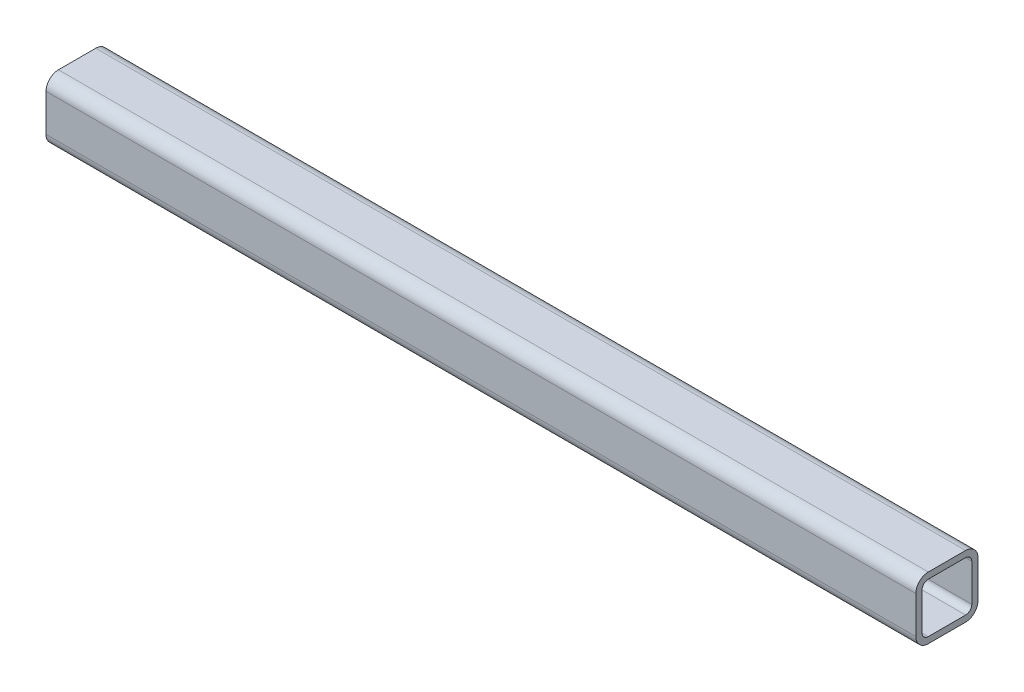
ISO-10303-21;
HEADER;
FILE_DESCRIPTION(('STEP AP214'),'2;1');
FILE_NAME('part.step','',(''),(''),'','','');
FILE_SCHEMA(('AUTOMOTIVE_DESIGN { 1 0 10303 214 1 1 1 1 }'));
ENDSEC;
DATA;
#1=APPLICATION_CONTEXT('core data for automotive mechanical design processes');
#2=APPLICATION_PROTOCOL_DEFINITION('international standard','automotive_design',2000,#1);
#3=PRODUCT_CONTEXT('',#1,'mechanical');
#4=PRODUCT('Part','Part','',(#3));
#5=PRODUCT_RELATED_PRODUCT_CATEGORY('part','',(#4));
#6=PRODUCT_DEFINITION_FORMATION('','',#4);
#7=PRODUCT_DEFINITION_CONTEXT('part definition',#1,'design');
#8=PRODUCT_DEFINITION('design','',#6,#7);
#9=PRODUCT_DEFINITION_SHAPE('','',#8);
#10=(LENGTH_UNIT() NAMED_UNIT(*) SI_UNIT(.MILLI.,.METRE.));
#11=(NAMED_UNIT(*) PLANE_ANGLE_UNIT() SI_UNIT($,.RADIAN.));
#12=(NAMED_UNIT(*) SI_UNIT($,.STERADIAN.) SOLID_ANGLE_UNIT());
#13=UNCERTAINTY_MEASURE_WITH_UNIT(LENGTH_MEASURE(1.E-05),#10,'distance_accuracy_value','');
#14=(GEOMETRIC_REPRESENTATION_CONTEXT(3) GLOBAL_UNCERTAINTY_ASSIGNED_CONTEXT((#13)) GLOBAL_UNIT_ASSIGNED_CONTEXT((#10,
#11,#12)) REPRESENTATION_CONTEXT('',''));
#15=CARTESIAN_POINT('',(0.,0.,0.));
#16=DIRECTION('',(0.,0.,1.));
#17=DIRECTION('',(1.,0.,0.));
#18=AXIS2_PLACEMENT_3D('',#15,#16,#17);
#19=CARTESIAN_POINT('',(700.,15.,15.));
#20=DIRECTION('',(-1.,0.,0.));
#21=DIRECTION('',(0.,0.,1.));
#22=AXIS2_PLACEMENT_3D('',#19,#20,#21);
#23=CYLINDRICAL_SURFACE('',#22,10.);
#24=CARTESIAN_POINT('',(0.,15.,15.));
#25=DIRECTION('',(1.,0.,0.));
#26=DIRECTION('',(0.,0.,-1.));
#27=AXIS2_PLACEMENT_3D('',#24,#25,#26);
#28=CIRCLE('',#27,10.);
#29=CARTESIAN_POINT('',(0.,25.,15.));
#30=VERTEX_POINT('',#29);
#31=CARTESIAN_POINT('',(0.,15.,25.));
#32=VERTEX_POINT('',#31);
#33=EDGE_CURVE('E252',#30,#32,#28,.T.);
#34=ORIENTED_EDGE('',*,*,#33,.T.);
#35=DIRECTION('',(-1.,0.,0.));
#36=VECTOR('',#35,1.);
#37=CARTESIAN_POINT('',(700.,15.,25.));
#38=LINE('',#37,#36);
#39=CARTESIAN_POINT('',(700.,15.,25.));
#40=VERTEX_POINT('',#39);
#41=EDGE_CURVE('E12',#40,#32,#38,.T.);
#42=ORIENTED_EDGE('',*,*,#41,.F.);
#43=CARTESIAN_POINT('',(700.,15.,15.));
#44=DIRECTION('',(1.,0.,0.));
#45=DIRECTION('',(0.,0.,-1.));
#46=AXIS2_PLACEMENT_3D('',#43,#44,#45);
#47=CIRCLE('',#46,10.);
#48=CARTESIAN_POINT('',(700.,25.,15.));
#49=VERTEX_POINT('',#48);
#50=EDGE_CURVE('E358',#49,#40,#47,.T.);
#51=ORIENTED_EDGE('',*,*,#50,.F.);
#52=DIRECTION('',(-1.,0.,0.));
#53=VECTOR('',#52,1.);
#54=CARTESIAN_POINT('',(700.,25.,15.));
#55=LINE('',#54,#53);
#56=EDGE_CURVE('E275',#49,#30,#55,.T.);
#57=ORIENTED_EDGE('',*,*,#56,.T.);
#58=EDGE_LOOP('',(#34,#42,#51,#57));
#59=FACE_BOUND('',#58,.T.);
#60=ADVANCED_FACE('F67',(#59),#23,.T.);
#61=CARTESIAN_POINT('',(700.,15.,25.));
#62=DIRECTION('',(0.,0.,-1.));
#63=DIRECTION('',(0.,1.,0.));
#64=AXIS2_PLACEMENT_3D('',#61,#62,#63);
#65=PLANE('',#64);
#66=DIRECTION('',(0.,-1.,0.));
#67=VECTOR('',#66,1.);
#68=CARTESIAN_POINT('',(0.,15.,25.));
#69=LINE('',#68,#67);
#70=CARTESIAN_POINT('',(0.,-15.,25.));
#71=VERTEX_POINT('',#70);
#72=EDGE_CURVE('E256',#32,#71,#69,.T.);
#73=ORIENTED_EDGE('',*,*,#72,.T.);
#74=DIRECTION('',(-1.,0.,0.));
#75=VECTOR('',#74,1.);
#76=CARTESIAN_POINT('',(700.,-15.,25.));
#77=LINE('',#76,#75);
#78=CARTESIAN_POINT('',(700.,-15.,25.));
#79=VERTEX_POINT('',#78);
#80=EDGE_CURVE('E78',#79,#71,#77,.T.);
#81=ORIENTED_EDGE('',*,*,#80,.F.);
#82=DIRECTION('',(0.,-1.,0.));
#83=VECTOR('',#82,1.);
#84=CARTESIAN_POINT('',(700.,15.,25.));
#85=LINE('',#84,#83);
#86=EDGE_CURVE('E361',#40,#79,#85,.T.);
#87=ORIENTED_EDGE('',*,*,#86,.F.);
#88=ORIENTED_EDGE('',*,*,#41,.T.);
#89=EDGE_LOOP('',(#73,#81,#87,#88));
#90=FACE_BOUND('',#89,.T.);
#91=ADVANCED_FACE('F400',(#90),#65,.F.);
#92=CARTESIAN_POINT('',(700.,-15.,15.));
#93=DIRECTION('',(-1.,0.,0.));
#94=DIRECTION('',(0.,0.,1.));
#95=AXIS2_PLACEMENT_3D('',#92,#93,#94);
#96=CYLINDRICAL_SURFACE('',#95,10.);
#97=CARTESIAN_POINT('',(0.,-15.,15.));
#98=DIRECTION('',(1.,0.,0.));
#99=DIRECTION('',(0.,0.,-1.));
#100=AXIS2_PLACEMENT_3D('',#97,#98,#99);
#101=CIRCLE('',#100,10.);
#102=CARTESIAN_POINT('',(0.,-25.,15.));
#103=VERTEX_POINT('',#102);
#104=EDGE_CURVE('E259',#71,#103,#101,.T.);
#105=ORIENTED_EDGE('',*,*,#104,.T.);
#106=DIRECTION('',(-1.,0.,0.));
#107=VECTOR('',#106,1.);
#108=CARTESIAN_POINT('',(700.,-25.,15.));
#109=LINE('',#108,#107);
#110=CARTESIAN_POINT('',(700.,-25.,15.));
#111=VERTEX_POINT('',#110);
#112=EDGE_CURVE('E286',#111,#103,#109,.T.);
#113=ORIENTED_EDGE('',*,*,#112,.F.);
#114=CARTESIAN_POINT('',(700.,-15.,15.));
#115=DIRECTION('',(1.,0.,0.));
#116=DIRECTION('',(0.,0.,-1.));
#117=AXIS2_PLACEMENT_3D('',#114,#115,#116);
#118=CIRCLE('',#117,10.);
#119=EDGE_CURVE('E364',#79,#111,#118,.T.);
#120=ORIENTED_EDGE('',*,*,#119,.F.);
#121=ORIENTED_EDGE('',*,*,#80,.T.);
#122=EDGE_LOOP('',(#105,#113,#120,#121));
#123=FACE_BOUND('',#122,.T.);
#124=ADVANCED_FACE('F405',(#123),#96,.T.);
#125=CARTESIAN_POINT('',(700.,-25.,-15.));
#126=DIRECTION('',(0.,1.,0.));
#127=DIRECTION('',(0.,0.,1.));
#128=AXIS2_PLACEMENT_3D('',#125,#126,#127);
#129=PLANE('',#128);
#130=DIRECTION('',(0.,0.,-1.));
#131=VECTOR('',#130,1.);
#132=CARTESIAN_POINT('',(0.,-25.,-15.));
#133=LINE('',#132,#131);
#134=CARTESIAN_POINT('',(0.,-25.,-15.));
#135=VERTEX_POINT('',#134);
#136=EDGE_CURVE('E262',#103,#135,#133,.T.);
#137=ORIENTED_EDGE('',*,*,#136,.T.);
#138=DIRECTION('',(-1.,0.,0.));
#139=VECTOR('',#138,1.);
#140=CARTESIAN_POINT('',(700.,-25.,-15.));
#141=LINE('',#140,#139);
#142=CARTESIAN_POINT('',(700.,-25.,-15.));
#143=VERTEX_POINT('',#142);
#144=EDGE_CURVE('E282',#143,#135,#141,.T.);
#145=ORIENTED_EDGE('',*,*,#144,.F.);
#146=DIRECTION('',(0.,0.,-1.));
#147=VECTOR('',#146,1.);
#148=CARTESIAN_POINT('',(700.,-25.,-15.));
#149=LINE('',#148,#147);
#150=EDGE_CURVE('E367',#111,#143,#149,.T.);
#151=ORIENTED_EDGE('',*,*,#150,.F.);
#152=ORIENTED_EDGE('',*,*,#112,.T.);
#153=EDGE_LOOP('',(#137,#145,#151,#152));
#154=FACE_BOUND('',#153,.T.);
#155=ADVANCED_FACE('F375',(#154),#129,.F.);
#156=CARTESIAN_POINT('',(700.,-15.,-15.));
#157=DIRECTION('',(-1.,0.,0.));
#158=DIRECTION('',(0.,0.,1.));
#159=AXIS2_PLACEMENT_3D('',#156,#157,#158);
#160=CYLINDRICAL_SURFACE('',#159,10.);
#161=CARTESIAN_POINT('',(0.,-15.,-15.));
#162=DIRECTION('',(1.,0.,0.));
#163=DIRECTION('',(0.,0.,-1.));
#164=AXIS2_PLACEMENT_3D('',#161,#162,#163);
#165=CIRCLE('',#164,10.);
#166=CARTESIAN_POINT('',(0.,-15.,-25.));
#167=VERTEX_POINT('',#166);
#168=EDGE_CURVE('E265',#135,#167,#165,.T.);
#169=ORIENTED_EDGE('',*,*,#168,.T.);
#170=DIRECTION('',(-1.,0.,0.));
#171=VECTOR('',#170,1.);
#172=CARTESIAN_POINT('',(700.,-15.,-25.));
#173=LINE('',#172,#171);
#174=CARTESIAN_POINT('',(700.,-15.,-25.));
#175=VERTEX_POINT('',#174);
#176=EDGE_CURVE('E209',#175,#167,#173,.T.);
#177=ORIENTED_EDGE('',*,*,#176,.F.);
#178=CARTESIAN_POINT('',(700.,-15.,-15.));
#179=DIRECTION('',(1.,0.,0.));
#180=DIRECTION('',(0.,0.,-1.));
#181=AXIS2_PLACEMENT_3D('',#178,#179,#180);
#182=CIRCLE('',#181,10.);
#183=EDGE_CURVE('E198',#143,#175,#182,.T.);
#184=ORIENTED_EDGE('',*,*,#183,.F.);
#185=ORIENTED_EDGE('',*,*,#144,.T.);
#186=EDGE_LOOP('',(#169,#177,#184,#185));
#187=FACE_BOUND('',#186,.T.);
#188=ADVANCED_FACE('F379',(#187),#160,.T.);
#189=CARTESIAN_POINT('',(700.,-15.,-25.));
#190=DIRECTION('',(0.,0.,1.));
#191=DIRECTION('',(0.,-1.,0.));
#192=AXIS2_PLACEMENT_3D('',#189,#190,#191);
#193=PLANE('',#192);
#194=DIRECTION('',(0.,1.,0.));
#195=VECTOR('',#194,1.);
#196=CARTESIAN_POINT('',(0.,-15.,-25.));
#197=LINE('',#196,#195);
#198=CARTESIAN_POINT('',(0.,15.,-25.));
#199=VERTEX_POINT('',#198);
#200=EDGE_CURVE('E207',#167,#199,#197,.T.);
#201=ORIENTED_EDGE('',*,*,#200,.T.);
#202=DIRECTION('',(-1.,0.,0.));
#203=VECTOR('',#202,1.);
#204=CARTESIAN_POINT('',(700.,15.,-25.));
#205=LINE('',#204,#203);
#206=CARTESIAN_POINT('',(700.,15.,-25.));
#207=VERTEX_POINT('',#206);
#208=EDGE_CURVE('E204',#207,#199,#205,.T.);
#209=ORIENTED_EDGE('',*,*,#208,.F.);
#210=DIRECTION('',(0.,1.,0.));
#211=VECTOR('',#210,1.);
#212=CARTESIAN_POINT('',(700.,-15.,-25.));
#213=LINE('',#212,#211);
#214=EDGE_CURVE('E192',#175,#207,#213,.T.);
#215=ORIENTED_EDGE('',*,*,#214,.F.);
#216=ORIENTED_EDGE('',*,*,#176,.T.);
#217=EDGE_LOOP('',(#201,#209,#215,#216));
#218=FACE_BOUND('',#217,.T.);
#219=ADVANCED_FACE('F205',(#218),#193,.F.);
#220=CARTESIAN_POINT('',(700.,15.,-15.));
#221=DIRECTION('',(-1.,0.,0.));
#222=DIRECTION('',(0.,0.,1.));
#223=AXIS2_PLACEMENT_3D('',#220,#221,#222);
#224=CYLINDRICAL_SURFACE('',#223,10.);
#225=CARTESIAN_POINT('',(0.,15.,-15.));
#226=DIRECTION('',(1.,0.,0.));
#227=DIRECTION('',(0.,0.,-1.));
#228=AXIS2_PLACEMENT_3D('',#225,#226,#227);
#229=CIRCLE('',#228,10.);
#230=CARTESIAN_POINT('',(0.,25.,-15.));
#231=VERTEX_POINT('',#230);
#232=EDGE_CURVE('E140',#199,#231,#229,.T.);
#233=ORIENTED_EDGE('',*,*,#232,.T.);
#234=DIRECTION('',(-1.,0.,0.));
#235=VECTOR('',#234,1.);
#236=CARTESIAN_POINT('',(700.,25.,-15.));
#237=LINE('',#236,#235);
#238=CARTESIAN_POINT('',(700.,25.,-15.));
#239=VERTEX_POINT('',#238);
#240=EDGE_CURVE('E210',#239,#231,#237,.T.);
#241=ORIENTED_EDGE('',*,*,#240,.F.);
#242=CARTESIAN_POINT('',(700.,15.,-15.));
#243=DIRECTION('',(1.,0.,0.));
#244=DIRECTION('',(0.,0.,-1.));
#245=AXIS2_PLACEMENT_3D('',#242,#243,#244);
#246=CIRCLE('',#245,10.);
#247=EDGE_CURVE('E196',#207,#239,#246,.T.);
#248=ORIENTED_EDGE('',*,*,#247,.F.);
#249=ORIENTED_EDGE('',*,*,#208,.T.);
#250=EDGE_LOOP('',(#233,#241,#248,#249));
#251=FACE_BOUND('',#250,.T.);
#252=ADVANCED_FACE('F212',(#251),#224,.T.);
#253=CARTESIAN_POINT('',(700.,-15.,15.));
#254=DIRECTION('',(-1.,0.,0.));
#255=DIRECTION('',(0.,0.,1.));
#256=AXIS2_PLACEMENT_3D('',#253,#254,#255);
#257=CYLINDRICAL_SURFACE('',#256,5.);
#258=CARTESIAN_POINT('',(0.,-15.,15.));
#259=DIRECTION('',(1.,0.,0.));
#260=DIRECTION('',(0.,0.,-1.));
#261=AXIS2_PLACEMENT_3D('',#258,#259,#260);
#262=CIRCLE('',#261,5.);
#263=CARTESIAN_POINT('',(0.,-15.,20.));
#264=VERTEX_POINT('',#263);
#265=CARTESIAN_POINT('',(0.,-20.,15.));
#266=VERTEX_POINT('',#265);
#267=EDGE_CURVE('E220',#264,#266,#262,.T.);
#268=ORIENTED_EDGE('',*,*,#267,.F.);
#269=DIRECTION('',(-1.,0.,0.));
#270=VECTOR('',#269,1.);
#271=CARTESIAN_POINT('',(700.,-15.,20.));
#272=LINE('',#271,#270);
#273=CARTESIAN_POINT('',(700.,-15.,20.));
#274=VERTEX_POINT('',#273);
#275=EDGE_CURVE('E71',#274,#264,#272,.T.);
#276=ORIENTED_EDGE('',*,*,#275,.F.);
#277=CARTESIAN_POINT('',(700.,-15.,15.));
#278=DIRECTION('',(1.,0.,0.));
#279=DIRECTION('',(0.,0.,-1.));
#280=AXIS2_PLACEMENT_3D('',#277,#278,#279);
#281=CIRCLE('',#280,5.);
#282=CARTESIAN_POINT('',(700.,-20.,15.));
#283=VERTEX_POINT('',#282);
#284=EDGE_CURVE('E274',#274,#283,#281,.T.);
#285=ORIENTED_EDGE('',*,*,#284,.T.);
#286=DIRECTION('',(-1.,0.,0.));
#287=VECTOR('',#286,1.);
#288=CARTESIAN_POINT('',(700.,-20.,15.));
#289=LINE('',#288,#287);
#290=EDGE_CURVE('E216',#283,#266,#289,.T.);
#291=ORIENTED_EDGE('',*,*,#290,.T.);
#292=EDGE_LOOP('',(#268,#276,#285,#291));
#293=FACE_BOUND('',#292,.T.);
#294=ADVANCED_FACE('F69',(#293),#257,.F.);
#295=CARTESIAN_POINT('',(700.,15.,20.));
#296=DIRECTION('',(0.,0.,-1.));
#297=DIRECTION('',(0.,1.,0.));
#298=AXIS2_PLACEMENT_3D('',#295,#296,#297);
#299=PLANE('',#298);
#300=DIRECTION('',(0.,-1.,0.));
#301=VECTOR('',#300,1.);
#302=CARTESIAN_POINT('',(0.,15.,20.));
#303=LINE('',#302,#301);
#304=CARTESIAN_POINT('',(0.,15.,20.));
#305=VERTEX_POINT('',#304);
#306=EDGE_CURVE('E224',#305,#264,#303,.T.);
#307=ORIENTED_EDGE('',*,*,#306,.F.);
#308=DIRECTION('',(-1.,0.,0.));
#309=VECTOR('',#308,1.);
#310=CARTESIAN_POINT('',(700.,15.,20.));
#311=LINE('',#310,#309);
#312=CARTESIAN_POINT('',(700.,15.,20.));
#313=VERTEX_POINT('',#312);
#314=EDGE_CURVE('E309',#313,#305,#311,.T.);
#315=ORIENTED_EDGE('',*,*,#314,.F.);
#316=DIRECTION('',(0.,-1.,0.));
#317=VECTOR('',#316,1.);
#318=CARTESIAN_POINT('',(700.,15.,20.));
#319=LINE('',#318,#317);
#320=EDGE_CURVE('E320',#313,#274,#319,.T.);
#321=ORIENTED_EDGE('',*,*,#320,.T.);
#322=ORIENTED_EDGE('',*,*,#275,.T.);
#323=EDGE_LOOP('',(#307,#315,#321,#322));
#324=FACE_BOUND('',#323,.T.);
#325=ADVANCED_FACE('F318',(#324),#299,.T.);
#326=CARTESIAN_POINT('',(700.,15.,15.));
#327=DIRECTION('',(-1.,0.,0.));
#328=DIRECTION('',(0.,0.,1.));
#329=AXIS2_PLACEMENT_3D('',#326,#327,#328);
#330=CYLINDRICAL_SURFACE('',#329,5.);
#331=CARTESIAN_POINT('',(0.,15.,15.));
#332=DIRECTION('',(1.,0.,0.));
#333=DIRECTION('',(0.,0.,-1.));
#334=AXIS2_PLACEMENT_3D('',#331,#332,#333);
#335=CIRCLE('',#334,5.);
#336=CARTESIAN_POINT('',(0.,20.,15.));
#337=VERTEX_POINT('',#336);
#338=EDGE_CURVE('E228',#337,#305,#335,.T.);
#339=ORIENTED_EDGE('',*,*,#338,.F.);
#340=DIRECTION('',(-1.,0.,0.));
#341=VECTOR('',#340,1.);
#342=CARTESIAN_POINT('',(700.,20.,15.));
#343=LINE('',#342,#341);
#344=CARTESIAN_POINT('',(700.,20.,15.));
#345=VERTEX_POINT('',#344);
#346=EDGE_CURVE('E307',#345,#337,#343,.T.);
#347=ORIENTED_EDGE('',*,*,#346,.F.);
#348=CARTESIAN_POINT('',(700.,15.,15.));
#349=DIRECTION('',(1.,0.,0.));
#350=DIRECTION('',(0.,0.,-1.));
#351=AXIS2_PLACEMENT_3D('',#348,#349,#350);
#352=CIRCLE('',#351,5.);
#353=EDGE_CURVE('E328',#345,#313,#352,.T.);
#354=ORIENTED_EDGE('',*,*,#353,.T.);
#355=ORIENTED_EDGE('',*,*,#314,.T.);
#356=EDGE_LOOP('',(#339,#347,#354,#355));
#357=FACE_BOUND('',#356,.T.);
#358=ADVANCED_FACE('F326',(#357),#330,.F.);
#359=CARTESIAN_POINT('',(700.,20.,15.));
#360=DIRECTION('',(0.,-1.,0.));
#361=DIRECTION('',(0.,0.,-1.));
#362=AXIS2_PLACEMENT_3D('',#359,#360,#361);
#363=PLANE('',#362);
#364=DIRECTION('',(0.,0.,1.));
#365=VECTOR('',#364,1.);
#366=CARTESIAN_POINT('',(0.,20.,15.));
#367=LINE('',#366,#365);
#368=CARTESIAN_POINT('',(0.,20.,-15.));
#369=VERTEX_POINT('',#368);
#370=EDGE_CURVE('E232',#369,#337,#367,.T.);
#371=ORIENTED_EDGE('',*,*,#370,.F.);
#372=DIRECTION('',(-1.,0.,0.));
#373=VECTOR('',#372,1.);
#374=CARTESIAN_POINT('',(700.,20.,-15.));
#375=LINE('',#374,#373);
#376=CARTESIAN_POINT('',(700.,20.,-15.));
#377=VERTEX_POINT('',#376);
#378=EDGE_CURVE('E304',#377,#369,#375,.T.);
#379=ORIENTED_EDGE('',*,*,#378,.F.);
#380=DIRECTION('',(0.,0.,1.));
#381=VECTOR('',#380,1.);
#382=CARTESIAN_POINT('',(700.,20.,15.));
#383=LINE('',#382,#381);
#384=EDGE_CURVE('E334',#377,#345,#383,.T.);
#385=ORIENTED_EDGE('',*,*,#384,.T.);
#386=ORIENTED_EDGE('',*,*,#346,.T.);
#387=EDGE_LOOP('',(#371,#379,#385,#386));
#388=FACE_BOUND('',#387,.T.);
#389=ADVANCED_FACE('F338',(#388),#363,.T.);
#390=CARTESIAN_POINT('',(700.,15.,-15.));
#391=DIRECTION('',(-1.,0.,0.));
#392=DIRECTION('',(0.,0.,1.));
#393=AXIS2_PLACEMENT_3D('',#390,#391,#392);
#394=CYLINDRICAL_SURFACE('',#393,5.);
#395=CARTESIAN_POINT('',(0.,15.,-15.));
#396=DIRECTION('',(1.,0.,0.));
#397=DIRECTION('',(0.,0.,-1.));
#398=AXIS2_PLACEMENT_3D('',#395,#396,#397);
#399=CIRCLE('',#398,5.);
#400=CARTESIAN_POINT('',(0.,15.,-20.));
#401=VERTEX_POINT('',#400);
#402=EDGE_CURVE('E236',#401,#369,#399,.T.);
#403=ORIENTED_EDGE('',*,*,#402,.F.);
#404=DIRECTION('',(-1.,0.,0.));
#405=VECTOR('',#404,1.);
#406=CARTESIAN_POINT('',(700.,15.,-20.));
#407=LINE('',#406,#405);
#408=CARTESIAN_POINT('',(700.,15.,-20.));
#409=VERTEX_POINT('',#408);
#410=EDGE_CURVE('E301',#409,#401,#407,.T.);
#411=ORIENTED_EDGE('',*,*,#410,.F.);
#412=CARTESIAN_POINT('',(700.,15.,-15.));
#413=DIRECTION('',(1.,0.,0.));
#414=DIRECTION('',(0.,0.,-1.));
#415=AXIS2_PLACEMENT_3D('',#412,#413,#414);
#416=CIRCLE('',#415,5.);
#417=EDGE_CURVE('E340',#409,#377,#416,.T.);
#418=ORIENTED_EDGE('',*,*,#417,.T.);
#419=ORIENTED_EDGE('',*,*,#378,.T.);
#420=EDGE_LOOP('',(#403,#411,#418,#419));
#421=FACE_BOUND('',#420,.T.);
#422=ADVANCED_FACE('F416',(#421),#394,.F.);
#423=CARTESIAN_POINT('',(700.,-15.,-20.));
#424=DIRECTION('',(0.,0.,1.));
#425=DIRECTION('',(0.,-1.,0.));
#426=AXIS2_PLACEMENT_3D('',#423,#424,#425);
#427=PLANE('',#426);
#428=DIRECTION('',(0.,1.,0.));
#429=VECTOR('',#428,1.);
#430=CARTESIAN_POINT('',(0.,-15.,-20.));
#431=LINE('',#430,#429);
#432=CARTESIAN_POINT('',(0.,-15.,-20.));
#433=VERTEX_POINT('',#432);
#434=EDGE_CURVE('E240',#433,#401,#431,.T.);
#435=ORIENTED_EDGE('',*,*,#434,.F.);
#436=DIRECTION('',(-1.,0.,0.));
#437=VECTOR('',#436,1.);
#438=CARTESIAN_POINT('',(700.,-15.,-20.));
#439=LINE('',#438,#437);
#440=CARTESIAN_POINT('',(700.,-15.,-20.));
#441=VERTEX_POINT('',#440);
#442=EDGE_CURVE('E298',#441,#433,#439,.T.);
#443=ORIENTED_EDGE('',*,*,#442,.F.);
#444=DIRECTION('',(0.,1.,0.));
#445=VECTOR('',#444,1.);
#446=CARTESIAN_POINT('',(700.,-15.,-20.));
#447=LINE('',#446,#445);
#448=EDGE_CURVE('E343',#441,#409,#447,.T.);
#449=ORIENTED_EDGE('',*,*,#448,.T.);
#450=ORIENTED_EDGE('',*,*,#410,.T.);
#451=EDGE_LOOP('',(#435,#443,#449,#450));
#452=FACE_BOUND('',#451,.T.);
#453=ADVANCED_FACE('F412',(#452),#427,.T.);
#454=CARTESIAN_POINT('',(700.,-15.,-15.));
#455=DIRECTION('',(-1.,0.,0.));
#456=DIRECTION('',(0.,0.,1.));
#457=AXIS2_PLACEMENT_3D('',#454,#455,#456);
#458=CYLINDRICAL_SURFACE('',#457,5.);
#459=CARTESIAN_POINT('',(0.,-15.,-15.));
#460=DIRECTION('',(1.,0.,0.));
#461=DIRECTION('',(0.,0.,-1.));
#462=AXIS2_PLACEMENT_3D('',#459,#460,#461);
#463=CIRCLE('',#462,5.);
#464=CARTESIAN_POINT('',(0.,-20.,-15.));
#465=VERTEX_POINT('',#464);
#466=EDGE_CURVE('E244',#465,#433,#463,.T.);
#467=ORIENTED_EDGE('',*,*,#466,.F.);
#468=DIRECTION('',(-1.,0.,0.));
#469=VECTOR('',#468,1.);
#470=CARTESIAN_POINT('',(700.,-20.,-15.));
#471=LINE('',#470,#469);
#472=CARTESIAN_POINT('',(700.,-20.,-15.));
#473=VERTEX_POINT('',#472);
#474=EDGE_CURVE('E295',#473,#465,#471,.T.);
#475=ORIENTED_EDGE('',*,*,#474,.F.);
#476=CARTESIAN_POINT('',(700.,-15.,-15.));
#477=DIRECTION('',(1.,0.,0.));
#478=DIRECTION('',(0.,0.,-1.));
#479=AXIS2_PLACEMENT_3D('',#476,#477,#478);
#480=CIRCLE('',#479,5.);
#481=EDGE_CURVE('E350',#473,#441,#480,.T.);
#482=ORIENTED_EDGE('',*,*,#481,.T.);
#483=ORIENTED_EDGE('',*,*,#442,.T.);
#484=EDGE_LOOP('',(#467,#475,#482,#483));
#485=FACE_BOUND('',#484,.T.);
#486=ADVANCED_FACE('F394',(#485),#458,.F.);
#487=CARTESIAN_POINT('',(700.,-20.,-15.));
#488=DIRECTION('',(0.,1.,0.));
#489=DIRECTION('',(0.,0.,1.));
#490=AXIS2_PLACEMENT_3D('',#487,#488,#489);
#491=PLANE('',#490);
#492=DIRECTION('',(0.,0.,-1.));
#493=VECTOR('',#492,1.);
#494=CARTESIAN_POINT('',(0.,-20.,-15.));
#495=LINE('',#494,#493);
#496=EDGE_CURVE('E248',#266,#465,#495,.T.);
#497=ORIENTED_EDGE('',*,*,#496,.F.);
#498=ORIENTED_EDGE('',*,*,#290,.F.);
#499=DIRECTION('',(0.,0.,-1.));
#500=VECTOR('',#499,1.);
#501=CARTESIAN_POINT('',(700.,-20.,-15.));
#502=LINE('',#501,#500);
#503=EDGE_CURVE('E354',#283,#473,#502,.T.);
#504=ORIENTED_EDGE('',*,*,#503,.T.);
#505=ORIENTED_EDGE('',*,*,#474,.T.);
#506=EDGE_LOOP('',(#497,#498,#504,#505));
#507=FACE_BOUND('',#506,.T.);
#508=ADVANCED_FACE('F387',(#507),#491,.T.);
#509=CARTESIAN_POINT('',(700.,25.,15.));
#510=DIRECTION('',(0.,-1.,0.));
#511=DIRECTION('',(0.,0.,-1.));
#512=AXIS2_PLACEMENT_3D('',#509,#510,#511);
#513=PLANE('',#512);
#514=DIRECTION('',(0.,0.,1.));
#515=VECTOR('',#514,1.);
#516=CARTESIAN_POINT('',(0.,25.,15.));
#517=LINE('',#516,#515);
#518=EDGE_CURVE('E146',#231,#30,#517,.T.);
#519=ORIENTED_EDGE('',*,*,#518,.T.);
#520=ORIENTED_EDGE('',*,*,#56,.F.);
#521=DIRECTION('',(0.,0.,1.));
#522=VECTOR('',#521,1.);
#523=CARTESIAN_POINT('',(700.,25.,15.));
#524=LINE('',#523,#522);
#525=EDGE_CURVE('E87',#239,#49,#524,.T.);
#526=ORIENTED_EDGE('',*,*,#525,.F.);
#527=ORIENTED_EDGE('',*,*,#240,.T.);
#528=EDGE_LOOP('',(#519,#520,#526,#527));
#529=FACE_BOUND('',#528,.T.);
#530=ADVANCED_FACE('F385',(#529),#513,.F.);
#531=CARTESIAN_POINT('',(700.,15.,15.));
#532=DIRECTION('',(1.,0.,0.));
#533=DIRECTION('',(0.,0.,-1.));
#534=AXIS2_PLACEMENT_3D('',#531,#532,#533);
#535=PLANE('',#534);
#536=ORIENTED_EDGE('',*,*,#284,.F.);
#537=ORIENTED_EDGE('',*,*,#320,.F.);
#538=ORIENTED_EDGE('',*,*,#353,.F.);
#539=ORIENTED_EDGE('',*,*,#384,.F.);
#540=ORIENTED_EDGE('',*,*,#417,.F.);
#541=ORIENTED_EDGE('',*,*,#448,.F.);
#542=ORIENTED_EDGE('',*,*,#481,.F.);
#543=ORIENTED_EDGE('',*,*,#503,.F.);
#544=EDGE_LOOP('',(#536,#537,#538,#539,#540,#541,#542,#543));
#545=FACE_BOUND('',#544,.T.);
#546=ORIENTED_EDGE('',*,*,#50,.T.);
#547=ORIENTED_EDGE('',*,*,#86,.T.);
#548=ORIENTED_EDGE('',*,*,#119,.T.);
#549=ORIENTED_EDGE('',*,*,#150,.T.);
#550=ORIENTED_EDGE('',*,*,#183,.T.);
#551=ORIENTED_EDGE('',*,*,#214,.T.);
#552=ORIENTED_EDGE('',*,*,#247,.T.);
#553=ORIENTED_EDGE('',*,*,#525,.T.);
#554=EDGE_LOOP('',(#546,#547,#548,#549,#550,#551,#552,#553));
#555=FACE_BOUND('',#554,.T.);
#556=ADVANCED_FACE('F194',(#545,#555),#535,.T.);
#557=CARTESIAN_POINT('',(0.,15.,15.));
#558=DIRECTION('',(1.,0.,0.));
#559=DIRECTION('',(0.,0.,-1.));
#560=AXIS2_PLACEMENT_3D('',#557,#558,#559);
#561=PLANE('',#560);
#562=ORIENTED_EDGE('',*,*,#267,.T.);
#563=ORIENTED_EDGE('',*,*,#496,.T.);
#564=ORIENTED_EDGE('',*,*,#466,.T.);
#565=ORIENTED_EDGE('',*,*,#434,.T.);
#566=ORIENTED_EDGE('',*,*,#402,.T.);
#567=ORIENTED_EDGE('',*,*,#370,.T.);
#568=ORIENTED_EDGE('',*,*,#338,.T.);
#569=ORIENTED_EDGE('',*,*,#306,.T.);
#570=EDGE_LOOP('',(#562,#563,#564,#565,#566,#567,#568,#569));
#571=FACE_BOUND('',#570,.T.);
#572=ORIENTED_EDGE('',*,*,#33,.F.);
#573=ORIENTED_EDGE('',*,*,#518,.F.);
#574=ORIENTED_EDGE('',*,*,#232,.F.);
#575=ORIENTED_EDGE('',*,*,#200,.F.);
#576=ORIENTED_EDGE('',*,*,#168,.F.);
#577=ORIENTED_EDGE('',*,*,#136,.F.);
#578=ORIENTED_EDGE('',*,*,#104,.F.);
#579=ORIENTED_EDGE('',*,*,#72,.F.);
#580=EDGE_LOOP('',(#572,#573,#574,#575,#576,#577,#578,#579));
#581=FACE_BOUND('',#580,.T.);
#582=ADVANCED_FACE('F323',(#571,#581),#561,.F.);
#583=CLOSED_SHELL('',(#60,#91,#124,#155,#188,#219,#252,#294,#325,#358,#389,#422,#453,#486,#508,
#530,#556,#582));
#584=MANIFOLD_SOLID_BREP('B2',#583);
#585=ADVANCED_BREP_SHAPE_REPRESENTATION('',(#18,#584),#14);
#586=SHAPE_DEFINITION_REPRESENTATION(#9,#585);
ENDSEC;
END-ISO-10303-21;
